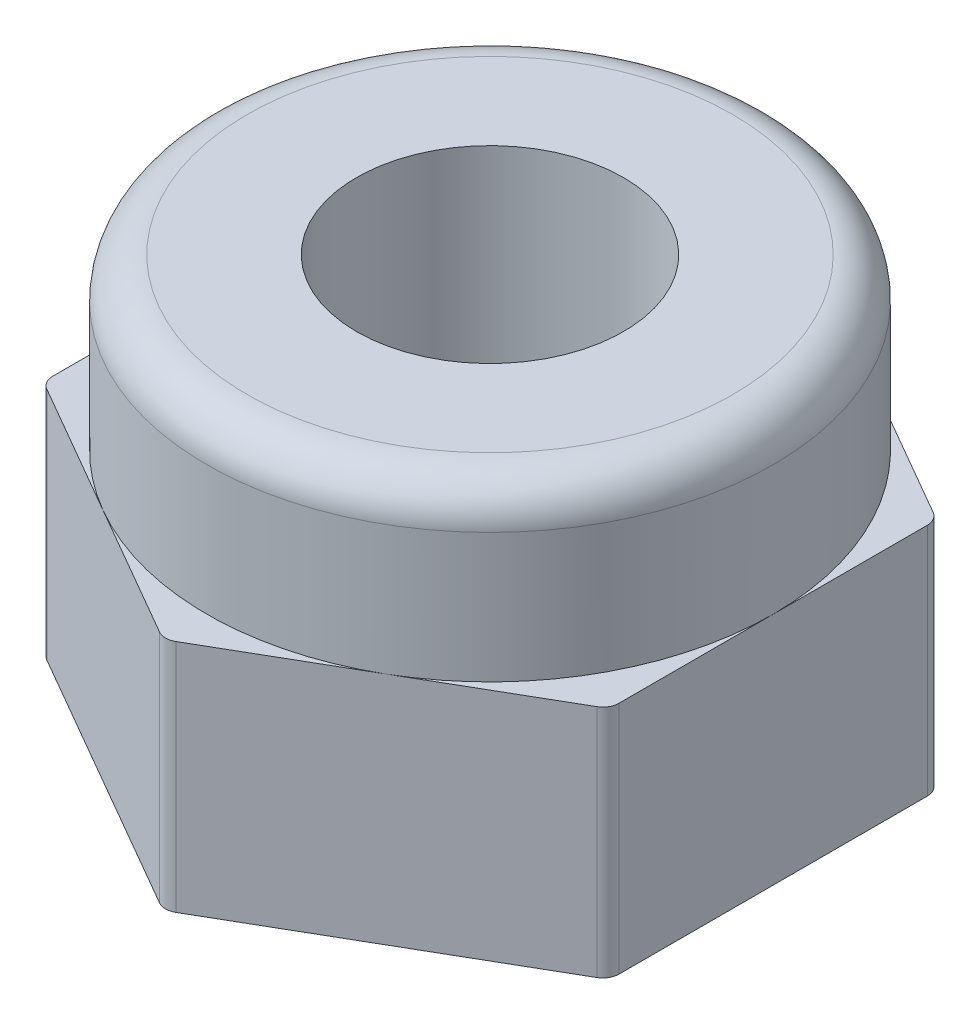
ISO-10303-21;
HEADER;
FILE_DESCRIPTION(('STEP AP214'),'2;1');
FILE_NAME('part.step','',(''),(''),'','','');
FILE_SCHEMA(('AUTOMOTIVE_DESIGN { 1 0 10303 214 1 1 1 1 }'));
ENDSEC;
DATA;
#1=APPLICATION_CONTEXT('core data for automotive mechanical design processes');
#2=APPLICATION_PROTOCOL_DEFINITION('international standard','automotive_design',2000,#1);
#3=PRODUCT_CONTEXT('',#1,'mechanical');
#4=PRODUCT('Part','Part','',(#3));
#5=PRODUCT_RELATED_PRODUCT_CATEGORY('part','',(#4));
#6=PRODUCT_DEFINITION_FORMATION('','',#4);
#7=PRODUCT_DEFINITION_CONTEXT('part definition',#1,'design');
#8=PRODUCT_DEFINITION('design','',#6,#7);
#9=PRODUCT_DEFINITION_SHAPE('','',#8);
#10=(LENGTH_UNIT() NAMED_UNIT(*) SI_UNIT(.MILLI.,.METRE.));
#11=(NAMED_UNIT(*) PLANE_ANGLE_UNIT() SI_UNIT($,.RADIAN.));
#12=(NAMED_UNIT(*) SI_UNIT($,.STERADIAN.) SOLID_ANGLE_UNIT());
#13=UNCERTAINTY_MEASURE_WITH_UNIT(LENGTH_MEASURE(1.E-05),#10,'distance_accuracy_value','');
#14=(GEOMETRIC_REPRESENTATION_CONTEXT(3) GLOBAL_UNCERTAINTY_ASSIGNED_CONTEXT((#13)) GLOBAL_UNIT_ASSIGNED_CONTEXT((#10,
#11,#12)) REPRESENTATION_CONTEXT('',''));
#15=CARTESIAN_POINT('',(0.,0.,0.));
#16=DIRECTION('',(0.,0.,1.));
#17=DIRECTION('',(1.,0.,0.));
#18=AXIS2_PLACEMENT_3D('',#15,#16,#17);
#19=CARTESIAN_POINT('',(0.,2.9,0.));
#20=DIRECTION('',(0.,1.,0.));
#21=DIRECTION('',(0.,0.,1.));
#22=AXIS2_PLACEMENT_3D('',#19,#20,#21);
#23=PLANE('',#22);
#24=DIRECTION('',(0.866025403784435,0.,-0.500000000000007));
#25=VECTOR('',#24,1.);
#26=CARTESIAN_POINT('',(0.,2.9,4.04145188432738));
#27=LINE('',#26,#25);
#28=CARTESIAN_POINT('',(1.75000000000002,2.9,3.03108891324552));
#29=VERTEX_POINT('',#28);
#30=CARTESIAN_POINT('',(3.40000000000002,2.9,2.07846096908262));
#31=VERTEX_POINT('',#30);
#32=EDGE_CURVE('E166',#29,#31,#27,.T.);
#33=ORIENTED_EDGE('',*,*,#32,.T.);
#34=CARTESIAN_POINT('',(3.30000000000002,2.9,1.90525588832574));
#35=DIRECTION('',(0.,1.,0.));
#36=DIRECTION('',(0.,0.,1.));
#37=AXIS2_PLACEMENT_3D('',#34,#35,#36);
#38=CIRCLE('',#37,0.2);
#39=CARTESIAN_POINT('',(3.50000000000002,2.9,1.90525588832573));
#40=VERTEX_POINT('',#39);
#41=EDGE_CURVE('E290',#31,#40,#38,.T.);
#42=ORIENTED_EDGE('',*,*,#41,.T.);
#43=DIRECTION('',(0.,0.,-1.));
#44=VECTOR('',#43,1.);
#45=CARTESIAN_POINT('',(3.50000000000002,2.9,2.02072594216366));
#46=LINE('',#45,#44);
#47=CARTESIAN_POINT('',(3.5,2.9,0.));
#48=VERTEX_POINT('',#47);
#49=EDGE_CURVE('E181',#40,#48,#46,.T.);
#50=ORIENTED_EDGE('',*,*,#49,.T.);
#51=CARTESIAN_POINT('',(0.,2.9,0.));
#52=DIRECTION('',(0.,1.,0.));
#53=DIRECTION('',(0.,0.,1.));
#54=AXIS2_PLACEMENT_3D('',#51,#52,#53);
#55=CIRCLE('',#54,3.50000000000002);
#56=EDGE_CURVE('E179',#29,#48,#55,.T.);
#57=ORIENTED_EDGE('',*,*,#56,.F.);
#58=EDGE_LOOP('',(#33,#42,#50,#57));
#59=FACE_BOUND('',#58,.T.);
#60=ADVANCED_FACE('F43',(#59),#23,.T.);
#61=CARTESIAN_POINT('',(3.49999999999998,2.9,-1.90525588832581));
#62=VERTEX_POINT('',#61);
#63=EDGE_CURVE('E165',#48,#62,#46,.T.);
#64=ORIENTED_EDGE('',*,*,#63,.T.);
#65=CARTESIAN_POINT('',(3.29999999999998,2.9,-1.90525588832581));
#66=DIRECTION('',(0.,1.,0.));
#67=DIRECTION('',(0.,0.,1.));
#68=AXIS2_PLACEMENT_3D('',#65,#66,#67);
#69=CIRCLE('',#68,0.2);
#70=CARTESIAN_POINT('',(3.39999999999998,2.9,-2.07846096908269));
#71=VERTEX_POINT('',#70);
#72=EDGE_CURVE('E282',#62,#71,#69,.T.);
#73=ORIENTED_EDGE('',*,*,#72,.T.);
#74=DIRECTION('',(-0.866025403784442,0.,-0.499999999999995));
#75=VECTOR('',#74,1.);
#76=CARTESIAN_POINT('',(3.49999999999998,2.9,-2.02072594216373));
#77=LINE('',#76,#75);
#78=CARTESIAN_POINT('',(1.74999999999999,2.9,-3.03108891324556));
#79=VERTEX_POINT('',#78);
#80=EDGE_CURVE('E204',#71,#79,#77,.T.);
#81=ORIENTED_EDGE('',*,*,#80,.T.);
#82=EDGE_CURVE('E187',#48,#79,#55,.T.);
#83=ORIENTED_EDGE('',*,*,#82,.F.);
#84=EDGE_LOOP('',(#64,#73,#81,#83));
#85=FACE_BOUND('',#84,.T.);
#86=ADVANCED_FACE('F373',(#85),#23,.T.);
#87=CARTESIAN_POINT('',(0.0999999999999994,2.9,-3.98371685740842));
#88=VERTEX_POINT('',#87);
#89=EDGE_CURVE('E208',#79,#88,#77,.T.);
#90=ORIENTED_EDGE('',*,*,#89,.T.);
#91=CARTESIAN_POINT('',(0.,2.9,-3.81051177665153));
#92=DIRECTION('',(0.,1.,0.));
#93=DIRECTION('',(0.,0.,1.));
#94=AXIS2_PLACEMENT_3D('',#91,#92,#93);
#95=CIRCLE('',#94,0.2);
#96=CARTESIAN_POINT('',(-0.0999999999999996,2.9,-3.98371685740842));
#97=VERTEX_POINT('',#96);
#98=EDGE_CURVE('E309',#88,#97,#95,.T.);
#99=ORIENTED_EDGE('',*,*,#98,.T.);
#100=DIRECTION('',(-0.866025403784438,0.,0.500000000000001));
#101=VECTOR('',#100,1.);
#102=CARTESIAN_POINT('',(0.,2.9,-4.04145188432738));
#103=LINE('',#102,#101);
#104=CARTESIAN_POINT('',(-1.75,2.9,-3.03108891324553));
#105=VERTEX_POINT('',#104);
#106=EDGE_CURVE('E209',#97,#105,#103,.T.);
#107=ORIENTED_EDGE('',*,*,#106,.T.);
#108=EDGE_CURVE('E327',#79,#105,#55,.T.);
#109=ORIENTED_EDGE('',*,*,#108,.F.);
#110=EDGE_LOOP('',(#90,#99,#107,#109));
#111=FACE_BOUND('',#110,.T.);
#112=ADVANCED_FACE('F367',(#111),#23,.T.);
#113=CARTESIAN_POINT('',(-3.40000000000001,2.9,-2.07846096908265));
#114=VERTEX_POINT('',#113);
#115=EDGE_CURVE('E207',#105,#114,#103,.T.);
#116=ORIENTED_EDGE('',*,*,#115,.T.);
#117=CARTESIAN_POINT('',(-3.30000000000001,2.9,-1.90525588832576));
#118=DIRECTION('',(0.,1.,0.));
#119=DIRECTION('',(0.,0.,1.));
#120=AXIS2_PLACEMENT_3D('',#117,#118,#119);
#121=CIRCLE('',#120,0.2);
#122=CARTESIAN_POINT('',(-3.50000000000001,2.9,-1.90525588832576));
#123=VERTEX_POINT('',#122);
#124=EDGE_CURVE('E52',#114,#123,#121,.T.);
#125=ORIENTED_EDGE('',*,*,#124,.T.);
#126=DIRECTION('',(0.,0.,1.));
#127=VECTOR('',#126,1.);
#128=CARTESIAN_POINT('',(-3.50000000000001,2.9,-2.02072594216368));
#129=LINE('',#128,#127);
#130=CARTESIAN_POINT('',(-3.5,2.9,0.));
#131=VERTEX_POINT('',#130);
#132=EDGE_CURVE('E213',#123,#131,#129,.T.);
#133=ORIENTED_EDGE('',*,*,#132,.T.);
#134=EDGE_CURVE('E198',#105,#131,#55,.T.);
#135=ORIENTED_EDGE('',*,*,#134,.F.);
#136=EDGE_LOOP('',(#116,#125,#133,#135));
#137=FACE_BOUND('',#136,.T.);
#138=ADVANCED_FACE('F333',(#137),#23,.T.);
#139=CARTESIAN_POINT('',(-3.49999999999999,2.9,1.90525588832578));
#140=VERTEX_POINT('',#139);
#141=EDGE_CURVE('E212',#131,#140,#129,.T.);
#142=ORIENTED_EDGE('',*,*,#141,.T.);
#143=CARTESIAN_POINT('',(-3.29999999999999,2.9,1.90525588832578));
#144=DIRECTION('',(0.,1.,0.));
#145=DIRECTION('',(0.,0.,1.));
#146=AXIS2_PLACEMENT_3D('',#143,#144,#145);
#147=CIRCLE('',#146,0.2);
#148=CARTESIAN_POINT('',(-3.39999999999999,2.9,2.07846096908267));
#149=VERTEX_POINT('',#148);
#150=EDGE_CURVE('E11',#140,#149,#147,.T.);
#151=ORIENTED_EDGE('',*,*,#150,.T.);
#152=DIRECTION('',(0.866025403784442,0.,0.499999999999995));
#153=VECTOR('',#152,1.);
#154=CARTESIAN_POINT('',(-3.49999999999999,2.9,2.02072594216371));
#155=LINE('',#154,#153);
#156=CARTESIAN_POINT('',(-1.74999999999998,2.9,3.03108891324555));
#157=VERTEX_POINT('',#156);
#158=EDGE_CURVE('E177',#149,#157,#155,.T.);
#159=ORIENTED_EDGE('',*,*,#158,.T.);
#160=EDGE_CURVE('E193',#131,#157,#55,.T.);
#161=ORIENTED_EDGE('',*,*,#160,.F.);
#162=EDGE_LOOP('',(#142,#151,#159,#161));
#163=FACE_BOUND('',#162,.T.);
#164=ADVANCED_FACE('F357',(#163),#23,.T.);
#165=CARTESIAN_POINT('',(3.49999999999998,2.9,-2.02072594216373));
#166=DIRECTION('',(-0.499999999999995,0.,0.866025403784442));
#167=DIRECTION('',(0.866025403784442,0.,0.499999999999995));
#168=AXIS2_PLACEMENT_3D('',#165,#166,#167);
#169=PLANE('',#168);
#170=ORIENTED_EDGE('',*,*,#80,.F.);
#171=DIRECTION('',(0.,-1.,0.));
#172=VECTOR('',#171,1.);
#173=CARTESIAN_POINT('',(3.39999999999998,2.9,-2.07846096908269));
#174=LINE('',#173,#172);
#175=CARTESIAN_POINT('',(3.39999999999998,0.,-2.07846096908269));
#176=VERTEX_POINT('',#175);
#177=EDGE_CURVE('E253',#71,#176,#174,.T.);
#178=ORIENTED_EDGE('',*,*,#177,.T.);
#179=DIRECTION('',(-0.866025403784442,0.,-0.499999999999995));
#180=VECTOR('',#179,1.);
#181=CARTESIAN_POINT('',(3.49999999999998,0.,-2.02072594216373));
#182=LINE('',#181,#180);
#183=CARTESIAN_POINT('',(0.0999999999999994,0.,-3.98371685740842));
#184=VERTEX_POINT('',#183);
#185=EDGE_CURVE('E186',#176,#184,#182,.T.);
#186=ORIENTED_EDGE('',*,*,#185,.T.);
#187=DIRECTION('',(0.,-1.,0.));
#188=VECTOR('',#187,1.);
#189=CARTESIAN_POINT('',(0.0999999999999994,2.9,-3.98371685740842));
#190=LINE('',#189,#188);
#191=EDGE_CURVE('E250',#184,#88,#190,.F.);
#192=ORIENTED_EDGE('',*,*,#191,.T.);
#193=ORIENTED_EDGE('',*,*,#89,.F.);
#194=EDGE_LOOP('',(#170,#178,#186,#192,#193));
#195=FACE_BOUND('',#194,.T.);
#196=ADVANCED_FACE('F359',(#195),#169,.F.);
#197=CARTESIAN_POINT('',(0.,2.9,-4.04145188432738));
#198=DIRECTION('',(0.500000000000001,0.,0.866025403784438));
#199=DIRECTION('',(0.866025403784438,0.,-0.500000000000001));
#200=AXIS2_PLACEMENT_3D('',#197,#198,#199);
#201=PLANE('',#200);
#202=ORIENTED_EDGE('',*,*,#106,.F.);
#203=DIRECTION('',(0.,-1.,0.));
#204=VECTOR('',#203,1.);
#205=CARTESIAN_POINT('',(-0.0999999999999996,2.9,-3.98371685740842));
#206=LINE('',#205,#204);
#207=CARTESIAN_POINT('',(-0.0999999999999996,0.,-3.98371685740842));
#208=VERTEX_POINT('',#207);
#209=EDGE_CURVE('E305',#97,#208,#206,.T.);
#210=ORIENTED_EDGE('',*,*,#209,.T.);
#211=DIRECTION('',(-0.866025403784438,0.,0.500000000000001));
#212=VECTOR('',#211,1.);
#213=CARTESIAN_POINT('',(0.,0.,-4.04145188432738));
#214=LINE('',#213,#212);
#215=CARTESIAN_POINT('',(-3.40000000000001,0.,-2.07846096908265));
#216=VERTEX_POINT('',#215);
#217=EDGE_CURVE('E225',#208,#216,#214,.T.);
#218=ORIENTED_EDGE('',*,*,#217,.T.);
#219=DIRECTION('',(0.,-1.,0.));
#220=VECTOR('',#219,1.);
#221=CARTESIAN_POINT('',(-3.40000000000001,2.9,-2.07846096908265));
#222=LINE('',#221,#220);
#223=EDGE_CURVE('E302',#216,#114,#222,.F.);
#224=ORIENTED_EDGE('',*,*,#223,.T.);
#225=ORIENTED_EDGE('',*,*,#115,.F.);
#226=EDGE_LOOP('',(#202,#210,#218,#224,#225));
#227=FACE_BOUND('',#226,.T.);
#228=ADVANCED_FACE('F336',(#227),#201,.F.);
#229=CARTESIAN_POINT('',(-3.50000000000001,2.9,-2.02072594216368));
#230=DIRECTION('',(1.,0.,0.));
#231=DIRECTION('',(0.,0.,-1.));
#232=AXIS2_PLACEMENT_3D('',#229,#230,#231);
#233=PLANE('',#232);
#234=ORIENTED_EDGE('',*,*,#132,.F.);
#235=DIRECTION('',(0.,-1.,0.));
#236=VECTOR('',#235,1.);
#237=CARTESIAN_POINT('',(-3.50000000000001,2.9,-1.90525588832576));
#238=LINE('',#237,#236);
#239=CARTESIAN_POINT('',(-3.50000000000001,0.,-1.90525588832576));
#240=VERTEX_POINT('',#239);
#241=EDGE_CURVE('E314',#123,#240,#238,.T.);
#242=ORIENTED_EDGE('',*,*,#241,.T.);
#243=DIRECTION('',(0.,0.,1.));
#244=VECTOR('',#243,1.);
#245=CARTESIAN_POINT('',(-3.50000000000001,0.,-2.02072594216368));
#246=LINE('',#245,#244);
#247=CARTESIAN_POINT('',(-3.49999999999999,0.,1.90525588832578));
#248=VERTEX_POINT('',#247);
#249=EDGE_CURVE('E229',#240,#248,#246,.T.);
#250=ORIENTED_EDGE('',*,*,#249,.T.);
#251=DIRECTION('',(0.,-1.,0.));
#252=VECTOR('',#251,1.);
#253=CARTESIAN_POINT('',(-3.49999999999999,2.9,1.90525588832578));
#254=LINE('',#253,#252);
#255=EDGE_CURVE('E66',#248,#140,#254,.F.);
#256=ORIENTED_EDGE('',*,*,#255,.T.);
#257=ORIENTED_EDGE('',*,*,#141,.F.);
#258=EDGE_LOOP('',(#234,#242,#250,#256,#257));
#259=FACE_BOUND('',#258,.T.);
#260=ADVANCED_FACE('F344',(#259),#233,.F.);
#261=CARTESIAN_POINT('',(-3.49999999999999,2.9,2.02072594216371));
#262=DIRECTION('',(0.499999999999995,0.,-0.866025403784442));
#263=DIRECTION('',(-0.866025403784442,0.,-0.499999999999995));
#264=AXIS2_PLACEMENT_3D('',#261,#262,#263);
#265=PLANE('',#264);
#266=DIRECTION('',(0.866025403784442,0.,0.499999999999995));
#267=VECTOR('',#266,1.);
#268=CARTESIAN_POINT('',(-3.49999999999999,0.,2.02072594216371));
#269=LINE('',#268,#267);
#270=CARTESIAN_POINT('',(-3.39999999999999,0.,2.07846096908267));
#271=VERTEX_POINT('',#270);
#272=CARTESIAN_POINT('',(-0.0999999999999721,0.,3.98371685740842));
#273=VERTEX_POINT('',#272);
#274=EDGE_CURVE('E232',#271,#273,#269,.T.);
#275=ORIENTED_EDGE('',*,*,#274,.T.);
#276=DIRECTION('',(0.,-1.,0.));
#277=VECTOR('',#276,1.);
#278=CARTESIAN_POINT('',(-0.0999999999999725,2.9,3.98371685740842));
#279=LINE('',#278,#277);
#280=CARTESIAN_POINT('',(-0.0999999999999721,2.9,3.98371685740842));
#281=VERTEX_POINT('',#280);
#282=EDGE_CURVE('E297',#273,#281,#279,.F.);
#283=ORIENTED_EDGE('',*,*,#282,.T.);
#284=EDGE_CURVE('E216',#157,#281,#155,.T.);
#285=ORIENTED_EDGE('',*,*,#284,.F.);
#286=ORIENTED_EDGE('',*,*,#158,.F.);
#287=DIRECTION('',(0.,-1.,0.));
#288=VECTOR('',#287,1.);
#289=CARTESIAN_POINT('',(-3.39999999999999,2.9,2.07846096908267));
#290=LINE('',#289,#288);
#291=EDGE_CURVE('E293',#149,#271,#290,.T.);
#292=ORIENTED_EDGE('',*,*,#291,.T.);
#293=EDGE_LOOP('',(#275,#283,#285,#286,#292));
#294=FACE_BOUND('',#293,.T.);
#295=ADVANCED_FACE('F354',(#294),#265,.F.);
#296=CARTESIAN_POINT('',(0.,2.9,4.04145188432738));
#297=DIRECTION('',(-0.500000000000007,0.,-0.866025403784435));
#298=DIRECTION('',(-0.866025403784435,0.,0.500000000000007));
#299=AXIS2_PLACEMENT_3D('',#296,#297,#298);
#300=PLANE('',#299);
#301=DIRECTION('',(0.866025403784435,0.,-0.500000000000007));
#302=VECTOR('',#301,1.);
#303=CARTESIAN_POINT('',(0.,0.,4.04145188432738));
#304=LINE('',#303,#302);
#305=CARTESIAN_POINT('',(0.100000000000028,0.,3.98371685740842));
#306=VERTEX_POINT('',#305);
#307=CARTESIAN_POINT('',(3.40000000000002,0.,2.07846096908262));
#308=VERTEX_POINT('',#307);
#309=EDGE_CURVE('E236',#306,#308,#304,.T.);
#310=ORIENTED_EDGE('',*,*,#309,.T.);
#311=DIRECTION('',(0.,-1.,0.));
#312=VECTOR('',#311,1.);
#313=CARTESIAN_POINT('',(3.40000000000002,2.9,2.07846096908262));
#314=LINE('',#313,#312);
#315=EDGE_CURVE('E173',#308,#31,#314,.F.);
#316=ORIENTED_EDGE('',*,*,#315,.T.);
#317=ORIENTED_EDGE('',*,*,#32,.F.);
#318=CARTESIAN_POINT('',(0.100000000000028,2.9,3.98371685740842));
#319=VERTEX_POINT('',#318);
#320=EDGE_CURVE('E152',#319,#29,#27,.T.);
#321=ORIENTED_EDGE('',*,*,#320,.F.);
#322=DIRECTION('',(0.,-1.,0.));
#323=VECTOR('',#322,1.);
#324=CARTESIAN_POINT('',(0.100000000000028,2.9,3.98371685740842));
#325=LINE('',#324,#323);
#326=EDGE_CURVE('E285',#319,#306,#325,.T.);
#327=ORIENTED_EDGE('',*,*,#326,.T.);
#328=EDGE_LOOP('',(#310,#316,#317,#321,#327));
#329=FACE_BOUND('',#328,.T.);
#330=ADVANCED_FACE('F171',(#329),#300,.F.);
#331=CARTESIAN_POINT('',(3.50000000000002,2.9,2.02072594216366));
#332=DIRECTION('',(-1.,0.,0.));
#333=DIRECTION('',(0.,0.,1.));
#334=AXIS2_PLACEMENT_3D('',#331,#332,#333);
#335=PLANE('',#334);
#336=DIRECTION('',(0.,0.,-1.));
#337=VECTOR('',#336,1.);
#338=CARTESIAN_POINT('',(3.50000000000002,0.,2.02072594216366));
#339=LINE('',#338,#337);
#340=CARTESIAN_POINT('',(3.50000000000002,0.,1.90525588832573));
#341=VERTEX_POINT('',#340);
#342=CARTESIAN_POINT('',(3.49999999999998,0.,-1.90525588832581));
#343=VERTEX_POINT('',#342);
#344=EDGE_CURVE('E239',#341,#343,#339,.T.);
#345=ORIENTED_EDGE('',*,*,#344,.T.);
#346=DIRECTION('',(0.,-1.,0.));
#347=VECTOR('',#346,1.);
#348=CARTESIAN_POINT('',(3.49999999999998,2.9,-1.90525588832581));
#349=LINE('',#348,#347);
#350=EDGE_CURVE('E279',#343,#62,#349,.F.);
#351=ORIENTED_EDGE('',*,*,#350,.T.);
#352=ORIENTED_EDGE('',*,*,#63,.F.);
#353=ORIENTED_EDGE('',*,*,#49,.F.);
#354=DIRECTION('',(0.,-1.,0.));
#355=VECTOR('',#354,1.);
#356=CARTESIAN_POINT('',(3.50000000000002,2.9,1.90525588832573));
#357=LINE('',#356,#355);
#358=EDGE_CURVE('E275',#40,#341,#357,.T.);
#359=ORIENTED_EDGE('',*,*,#358,.T.);
#360=EDGE_LOOP('',(#345,#351,#352,#353,#359));
#361=FACE_BOUND('',#360,.T.);
#362=ADVANCED_FACE('F371',(#361),#335,.F.);
#363=ORIENTED_EDGE('',*,*,#284,.T.);
#364=CARTESIAN_POINT('',(0.,2.9,3.81051177665153));
#365=DIRECTION('',(0.,1.,0.));
#366=DIRECTION('',(0.,0.,1.));
#367=AXIS2_PLACEMENT_3D('',#364,#365,#366);
#368=CIRCLE('',#367,0.2);
#369=EDGE_CURVE('E160',#281,#319,#368,.T.);
#370=ORIENTED_EDGE('',*,*,#369,.T.);
#371=ORIENTED_EDGE('',*,*,#320,.T.);
#372=EDGE_CURVE('E157',#157,#29,#55,.T.);
#373=ORIENTED_EDGE('',*,*,#372,.F.);
#374=EDGE_LOOP('',(#363,#370,#371,#373));
#375=FACE_BOUND('',#374,.T.);
#376=ADVANCED_FACE('F155',(#375),#23,.T.);
#377=CARTESIAN_POINT('',(0.,0.,0.));
#378=DIRECTION('',(0.,1.,0.));
#379=DIRECTION('',(0.,0.,1.));
#380=AXIS2_PLACEMENT_3D('',#377,#378,#379);
#381=PLANE('',#380);
#382=CARTESIAN_POINT('',(0.,0.,0.));
#383=DIRECTION('',(0.,-1.,0.));
#384=DIRECTION('',(0.,0.,-1.));
#385=AXIS2_PLACEMENT_3D('',#382,#383,#384);
#386=CIRCLE('',#385,1.64999999999999);
#387=CARTESIAN_POINT('',(0.,0.,-1.64999999999999));
#388=VERTEX_POINT('',#387);
#389=EDGE_CURVE('E200',#388,#388,#386,.T.);
#390=ORIENTED_EDGE('',*,*,#389,.F.);
#391=EDGE_LOOP('',(#390));
#392=FACE_BOUND('',#391,.T.);
#393=ORIENTED_EDGE('',*,*,#185,.F.);
#394=CARTESIAN_POINT('',(3.29999999999998,0.,-1.90525588832581));
#395=DIRECTION('',(0.,1.,0.));
#396=DIRECTION('',(0.,0.,1.));
#397=AXIS2_PLACEMENT_3D('',#394,#395,#396);
#398=CIRCLE('',#397,0.2);
#399=EDGE_CURVE('E272',#176,#343,#398,.F.);
#400=ORIENTED_EDGE('',*,*,#399,.T.);
#401=ORIENTED_EDGE('',*,*,#344,.F.);
#402=CARTESIAN_POINT('',(3.30000000000002,0.,1.90525588832574));
#403=DIRECTION('',(0.,1.,0.));
#404=DIRECTION('',(0.,0.,1.));
#405=AXIS2_PLACEMENT_3D('',#402,#403,#404);
#406=CIRCLE('',#405,0.2);
#407=EDGE_CURVE('E269',#341,#308,#406,.F.);
#408=ORIENTED_EDGE('',*,*,#407,.T.);
#409=ORIENTED_EDGE('',*,*,#309,.F.);
#410=CARTESIAN_POINT('',(0.,0.,3.81051177665153));
#411=DIRECTION('',(0.,1.,0.));
#412=DIRECTION('',(0.,0.,1.));
#413=AXIS2_PLACEMENT_3D('',#410,#411,#412);
#414=CIRCLE('',#413,0.2);
#415=EDGE_CURVE('E266',#306,#273,#414,.F.);
#416=ORIENTED_EDGE('',*,*,#415,.T.);
#417=ORIENTED_EDGE('',*,*,#274,.F.);
#418=CARTESIAN_POINT('',(-3.29999999999999,0.,1.90525588832578));
#419=DIRECTION('',(0.,1.,0.));
#420=DIRECTION('',(0.,0.,1.));
#421=AXIS2_PLACEMENT_3D('',#418,#419,#420);
#422=CIRCLE('',#421,0.2);
#423=EDGE_CURVE('E257',#271,#248,#422,.F.);
#424=ORIENTED_EDGE('',*,*,#423,.T.);
#425=ORIENTED_EDGE('',*,*,#249,.F.);
#426=CARTESIAN_POINT('',(-3.30000000000001,0.,-1.90525588832576));
#427=DIRECTION('',(0.,1.,0.));
#428=DIRECTION('',(0.,0.,1.));
#429=AXIS2_PLACEMENT_3D('',#426,#427,#428);
#430=CIRCLE('',#429,0.2);
#431=EDGE_CURVE('E260',#240,#216,#430,.F.);
#432=ORIENTED_EDGE('',*,*,#431,.T.);
#433=ORIENTED_EDGE('',*,*,#217,.F.);
#434=CARTESIAN_POINT('',(0.,0.,-3.81051177665153));
#435=DIRECTION('',(0.,1.,0.));
#436=DIRECTION('',(0.,0.,1.));
#437=AXIS2_PLACEMENT_3D('',#434,#435,#436);
#438=CIRCLE('',#437,0.2);
#439=EDGE_CURVE('E263',#208,#184,#438,.F.);
#440=ORIENTED_EDGE('',*,*,#439,.T.);
#441=EDGE_LOOP('',(#393,#400,#401,#408,#409,#416,#417,#424,#425,#432,#433,#440));
#442=FACE_BOUND('',#441,.T.);
#443=ADVANCED_FACE('F347',(#392,#442),#381,.F.);
#444=CARTESIAN_POINT('',(0.,5.,0.));
#445=DIRECTION('',(0.,-1.,0.));
#446=DIRECTION('',(0.,0.,-1.));
#447=AXIS2_PLACEMENT_3D('',#444,#445,#446);
#448=CYLINDRICAL_SURFACE('',#447,3.50000000000002);
#449=CARTESIAN_POINT('',(0.,4.5,0.));
#450=DIRECTION('',(0.,-1.,0.));
#451=DIRECTION('',(0.,0.,-1.));
#452=AXIS2_PLACEMENT_3D('',#449,#450,#451);
#453=CIRCLE('',#452,3.50000000000002);
#454=CARTESIAN_POINT('',(0.,4.5,-3.50000000000002));
#455=VERTEX_POINT('',#454);
#456=EDGE_CURVE('E221',#455,#455,#453,.T.);
#457=ORIENTED_EDGE('',*,*,#456,.T.);
#458=EDGE_LOOP('',(#457));
#459=FACE_BOUND('',#458,.T.);
#460=ORIENTED_EDGE('',*,*,#372,.T.);
#461=ORIENTED_EDGE('',*,*,#56,.T.);
#462=ORIENTED_EDGE('',*,*,#82,.T.);
#463=ORIENTED_EDGE('',*,*,#108,.T.);
#464=ORIENTED_EDGE('',*,*,#134,.T.);
#465=ORIENTED_EDGE('',*,*,#160,.T.);
#466=EDGE_LOOP('',(#460,#461,#462,#463,#464,#465));
#467=FACE_BOUND('',#466,.T.);
#468=ADVANCED_FACE('F190',(#459,#467),#448,.T.);
#469=CARTESIAN_POINT('',(0.,5.,0.));
#470=DIRECTION('',(0.,-1.,0.));
#471=DIRECTION('',(0.,0.,-1.));
#472=AXIS2_PLACEMENT_3D('',#469,#470,#471);
#473=PLANE('',#472);
#474=CARTESIAN_POINT('',(0.,5.,0.));
#475=DIRECTION('',(0.,-1.,0.));
#476=DIRECTION('',(0.,0.,-1.));
#477=AXIS2_PLACEMENT_3D('',#474,#475,#476);
#478=CIRCLE('',#477,1.65);
#479=CARTESIAN_POINT('',(0.,5.,-1.65));
#480=VERTEX_POINT('',#479);
#481=EDGE_CURVE('E195',#480,#480,#478,.T.);
#482=ORIENTED_EDGE('',*,*,#481,.T.);
#483=EDGE_LOOP('',(#482));
#484=FACE_BOUND('',#483,.T.);
#485=CARTESIAN_POINT('',(0.,5.,0.));
#486=DIRECTION('',(0.,-1.,0.));
#487=DIRECTION('',(0.,0.,-1.));
#488=AXIS2_PLACEMENT_3D('',#485,#486,#487);
#489=CIRCLE('',#488,3.00000000000002);
#490=CARTESIAN_POINT('',(0.,5.,-3.00000000000002));
#491=VERTEX_POINT('',#490);
#492=EDGE_CURVE('E246',#491,#491,#489,.F.);
#493=ORIENTED_EDGE('',*,*,#492,.T.);
#494=EDGE_LOOP('',(#493));
#495=FACE_BOUND('',#494,.T.);
#496=ADVANCED_FACE('F414',(#484,#495),#473,.F.);
#497=CARTESIAN_POINT('',(0.,4.5,0.));
#498=DIRECTION('',(0.,-1.,0.));
#499=DIRECTION('',(0.,0.,-1.));
#500=AXIS2_PLACEMENT_3D('',#497,#498,#499);
#501=TOROIDAL_SURFACE('',#500,3.00000000000002,0.5);
#502=ORIENTED_EDGE('',*,*,#492,.F.);
#503=EDGE_LOOP('',(#502));
#504=FACE_BOUND('',#503,.T.);
#505=ORIENTED_EDGE('',*,*,#456,.F.);
#506=EDGE_LOOP('',(#505));
#507=FACE_BOUND('',#506,.T.);
#508=ADVANCED_FACE('F412',(#504,#507),#501,.T.);
#509=CARTESIAN_POINT('',(3.29999999999998,2.9,-1.90525588832581));
#510=DIRECTION('',(0.,-1.,0.));
#511=DIRECTION('',(0.,0.,-1.));
#512=AXIS2_PLACEMENT_3D('',#509,#510,#511);
#513=CYLINDRICAL_SURFACE('',#512,0.2);
#514=ORIENTED_EDGE('',*,*,#72,.F.);
#515=ORIENTED_EDGE('',*,*,#350,.F.);
#516=ORIENTED_EDGE('',*,*,#399,.F.);
#517=ORIENTED_EDGE('',*,*,#177,.F.);
#518=EDGE_LOOP('',(#514,#515,#516,#517));
#519=FACE_BOUND('',#518,.T.);
#520=ADVANCED_FACE('F389',(#519),#513,.T.);
#521=CARTESIAN_POINT('',(3.30000000000002,2.9,1.90525588832574));
#522=DIRECTION('',(0.,-1.,0.));
#523=DIRECTION('',(0.,0.,-1.));
#524=AXIS2_PLACEMENT_3D('',#521,#522,#523);
#525=CYLINDRICAL_SURFACE('',#524,0.2);
#526=ORIENTED_EDGE('',*,*,#41,.F.);
#527=ORIENTED_EDGE('',*,*,#315,.F.);
#528=ORIENTED_EDGE('',*,*,#407,.F.);
#529=ORIENTED_EDGE('',*,*,#358,.F.);
#530=EDGE_LOOP('',(#526,#527,#528,#529));
#531=FACE_BOUND('',#530,.T.);
#532=ADVANCED_FACE('F403',(#531),#525,.T.);
#533=CARTESIAN_POINT('',(0.,2.9,3.81051177665153));
#534=DIRECTION('',(0.,-1.,0.));
#535=DIRECTION('',(0.,0.,-1.));
#536=AXIS2_PLACEMENT_3D('',#533,#534,#535);
#537=CYLINDRICAL_SURFACE('',#536,0.2);
#538=ORIENTED_EDGE('',*,*,#369,.F.);
#539=ORIENTED_EDGE('',*,*,#282,.F.);
#540=ORIENTED_EDGE('',*,*,#415,.F.);
#541=ORIENTED_EDGE('',*,*,#326,.F.);
#542=EDGE_LOOP('',(#538,#539,#540,#541));
#543=FACE_BOUND('',#542,.T.);
#544=ADVANCED_FACE('F397',(#543),#537,.T.);
#545=CARTESIAN_POINT('',(0.,2.9,-3.81051177665153));
#546=DIRECTION('',(0.,-1.,0.));
#547=DIRECTION('',(0.,0.,-1.));
#548=AXIS2_PLACEMENT_3D('',#545,#546,#547);
#549=CYLINDRICAL_SURFACE('',#548,0.2);
#550=ORIENTED_EDGE('',*,*,#98,.F.);
#551=ORIENTED_EDGE('',*,*,#191,.F.);
#552=ORIENTED_EDGE('',*,*,#439,.F.);
#553=ORIENTED_EDGE('',*,*,#209,.F.);
#554=EDGE_LOOP('',(#550,#551,#552,#553));
#555=FACE_BOUND('',#554,.T.);
#556=ADVANCED_FACE('F395',(#555),#549,.T.);
#557=CARTESIAN_POINT('',(-3.30000000000001,2.9,-1.90525588832576));
#558=DIRECTION('',(0.,-1.,0.));
#559=DIRECTION('',(0.,0.,-1.));
#560=AXIS2_PLACEMENT_3D('',#557,#558,#559);
#561=CYLINDRICAL_SURFACE('',#560,0.2);
#562=ORIENTED_EDGE('',*,*,#124,.F.);
#563=ORIENTED_EDGE('',*,*,#223,.F.);
#564=ORIENTED_EDGE('',*,*,#431,.F.);
#565=ORIENTED_EDGE('',*,*,#241,.F.);
#566=EDGE_LOOP('',(#562,#563,#564,#565));
#567=FACE_BOUND('',#566,.T.);
#568=ADVANCED_FACE('F341',(#567),#561,.T.);
#569=CARTESIAN_POINT('',(-3.29999999999999,2.9,1.90525588832578));
#570=DIRECTION('',(0.,-1.,0.));
#571=DIRECTION('',(0.,0.,-1.));
#572=AXIS2_PLACEMENT_3D('',#569,#570,#571);
#573=CYLINDRICAL_SURFACE('',#572,0.2);
#574=ORIENTED_EDGE('',*,*,#150,.F.);
#575=ORIENTED_EDGE('',*,*,#255,.F.);
#576=ORIENTED_EDGE('',*,*,#423,.F.);
#577=ORIENTED_EDGE('',*,*,#291,.F.);
#578=EDGE_LOOP('',(#574,#575,#576,#577));
#579=FACE_BOUND('',#578,.T.);
#580=ADVANCED_FACE('F45',(#579),#573,.T.);
#581=CARTESIAN_POINT('',(0.,0.,0.));
#582=DIRECTION('',(0.,-1.,0.));
#583=DIRECTION('',(0.,0.,-1.));
#584=AXIS2_PLACEMENT_3D('',#581,#582,#583);
#585=CYLINDRICAL_SURFACE('',#584,1.64999999999999);
#586=ORIENTED_EDGE('',*,*,#481,.F.);
#587=EDGE_LOOP('',(#586));
#588=FACE_BOUND('',#587,.T.);
#589=ORIENTED_EDGE('',*,*,#389,.T.);
#590=EDGE_LOOP('',(#589));
#591=FACE_BOUND('',#590,.T.);
#592=ADVANCED_FACE('F436',(#588,#591),#585,.F.);
#593=CLOSED_SHELL('',(#60,#86,#112,#138,#164,#196,#228,#260,#295,#330,#362,#376,#443,#468,#496,
#508,#520,#532,#544,#556,#568,#580,#592));
#594=MANIFOLD_SOLID_BREP('B2',#593);
#595=ADVANCED_BREP_SHAPE_REPRESENTATION('',(#18,#594),#14);
#596=SHAPE_DEFINITION_REPRESENTATION(#9,#595);
ENDSEC;
END-ISO-10303-21;
